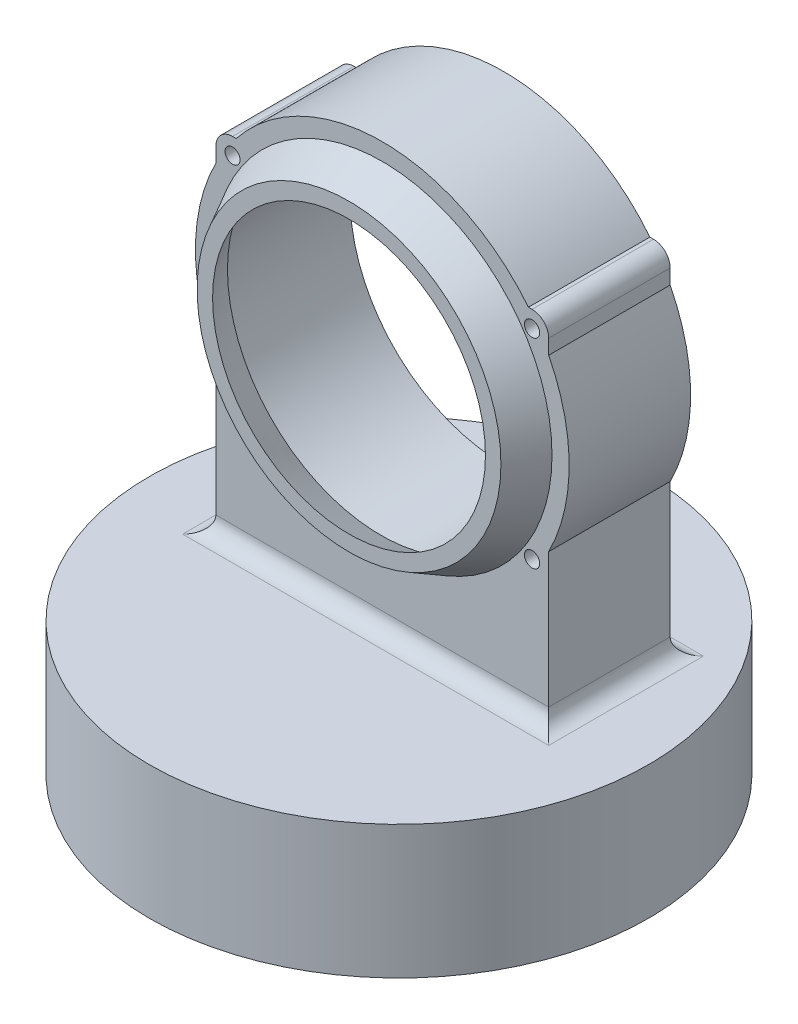
ISO-10303-21;
HEADER;
FILE_DESCRIPTION(('STEP AP214'),'2;1');
FILE_NAME('part.step','',(''),(''),'','','');
FILE_SCHEMA(('AUTOMOTIVE_DESIGN { 1 0 10303 214 1 1 1 1 }'));
ENDSEC;
DATA;
#1=APPLICATION_CONTEXT('core data for automotive mechanical design processes');
#2=APPLICATION_PROTOCOL_DEFINITION('international standard','automotive_design',2000,#1);
#3=PRODUCT_CONTEXT('',#1,'mechanical');
#4=PRODUCT('Part','Part','',(#3));
#5=PRODUCT_RELATED_PRODUCT_CATEGORY('part','',(#4));
#6=PRODUCT_DEFINITION_FORMATION('','',#4);
#7=PRODUCT_DEFINITION_CONTEXT('part definition',#1,'design');
#8=PRODUCT_DEFINITION('design','',#6,#7);
#9=PRODUCT_DEFINITION_SHAPE('','',#8);
#10=(LENGTH_UNIT() NAMED_UNIT(*) SI_UNIT(.MILLI.,.METRE.));
#11=(NAMED_UNIT(*) PLANE_ANGLE_UNIT() SI_UNIT($,.RADIAN.));
#12=(NAMED_UNIT(*) SI_UNIT($,.STERADIAN.) SOLID_ANGLE_UNIT());
#13=UNCERTAINTY_MEASURE_WITH_UNIT(LENGTH_MEASURE(1.E-05),#10,'distance_accuracy_value','');
#14=(GEOMETRIC_REPRESENTATION_CONTEXT(3) GLOBAL_UNCERTAINTY_ASSIGNED_CONTEXT((#13)) GLOBAL_UNIT_ASSIGNED_CONTEXT((#10,
#11,#12)) REPRESENTATION_CONTEXT('',''));
#15=CARTESIAN_POINT('',(0.,0.,0.));
#16=DIRECTION('',(0.,0.,1.));
#17=DIRECTION('',(1.,0.,0.));
#18=AXIS2_PLACEMENT_3D('',#15,#16,#17);
#19=CARTESIAN_POINT('',(0.,40.,0.));
#20=DIRECTION('',(0.,-1.,0.));
#21=DIRECTION('',(0.,0.,-1.));
#22=AXIS2_PLACEMENT_3D('',#19,#20,#21);
#23=CYLINDRICAL_SURFACE('',#22,75.);
#24=CARTESIAN_POINT('',(0.,40.,0.));
#25=DIRECTION('',(0.,1.,0.));
#26=DIRECTION('',(0.,0.,1.));
#27=AXIS2_PLACEMENT_3D('',#24,#25,#26);
#28=CIRCLE('',#27,75.);
#29=CARTESIAN_POINT('',(0.,40.,75.));
#30=VERTEX_POINT('',#29);
#31=EDGE_CURVE('E338',#30,#30,#28,.T.);
#32=ORIENTED_EDGE('',*,*,#31,.F.);
#33=EDGE_LOOP('',(#32));
#34=FACE_BOUND('',#33,.T.);
#35=CARTESIAN_POINT('',(0.,0.,0.));
#36=DIRECTION('',(0.,1.,0.));
#37=DIRECTION('',(0.,0.,1.));
#38=AXIS2_PLACEMENT_3D('',#35,#36,#37);
#39=CIRCLE('',#38,75.);
#40=CARTESIAN_POINT('',(0.,0.,75.));
#41=VERTEX_POINT('',#40);
#42=EDGE_CURVE('E281',#41,#41,#39,.T.);
#43=ORIENTED_EDGE('',*,*,#42,.T.);
#44=EDGE_LOOP('',(#43));
#45=FACE_BOUND('',#44,.T.);
#46=ADVANCED_FACE('F139',(#34,#45),#23,.T.);
#47=CARTESIAN_POINT('',(0.,40.,0.));
#48=DIRECTION('',(0.,1.,0.));
#49=DIRECTION('',(0.,0.,1.));
#50=AXIS2_PLACEMENT_3D('',#47,#48,#49);
#51=PLANE('',#50);
#52=DIRECTION('',(0.,0.,1.));
#53=VECTOR('',#52,1.);
#54=CARTESIAN_POINT('',(-55.,40.,-31.5));
#55=LINE('',#54,#53);
#56=CARTESIAN_POINT('',(-55.,40.,10.));
#57=VERTEX_POINT('',#56);
#58=CARTESIAN_POINT('',(-55.,40.,-36.5));
#59=VERTEX_POINT('',#58);
#60=EDGE_CURVE('E353',#57,#59,#55,.F.);
#61=ORIENTED_EDGE('',*,*,#60,.T.);
#62=DIRECTION('',(1.,0.,0.));
#63=VECTOR('',#62,1.);
#64=CARTESIAN_POINT('',(0.,40.,-36.5));
#65=LINE('',#64,#63);
#66=CARTESIAN_POINT('',(55.,40.,-36.5));
#67=VERTEX_POINT('',#66);
#68=EDGE_CURVE('E355',#59,#67,#65,.T.);
#69=ORIENTED_EDGE('',*,*,#68,.T.);
#70=DIRECTION('',(0.,0.,1.));
#71=VECTOR('',#70,1.);
#72=CARTESIAN_POINT('',(55.,40.,0.));
#73=LINE('',#72,#71);
#74=CARTESIAN_POINT('',(55.,40.,10.));
#75=VERTEX_POINT('',#74);
#76=EDGE_CURVE('E349',#67,#75,#73,.T.);
#77=ORIENTED_EDGE('',*,*,#76,.T.);
#78=DIRECTION('',(1.,0.,0.));
#79=VECTOR('',#78,1.);
#80=CARTESIAN_POINT('',(-50.,40.,10.));
#81=LINE('',#80,#79);
#82=EDGE_CURVE('E351',#75,#57,#81,.F.);
#83=ORIENTED_EDGE('',*,*,#82,.T.);
#84=EDGE_LOOP('',(#61,#69,#77,#83));
#85=FACE_BOUND('',#84,.T.);
#86=ORIENTED_EDGE('',*,*,#31,.T.);
#87=EDGE_LOOP('',(#86));
#88=FACE_BOUND('',#87,.T.);
#89=ADVANCED_FACE('F446',(#85,#88),#51,.T.);
#90=CARTESIAN_POINT('',(0.,0.,0.));
#91=DIRECTION('',(0.,1.,0.));
#92=DIRECTION('',(0.,0.,1.));
#93=AXIS2_PLACEMENT_3D('',#90,#91,#92);
#94=PLANE('',#93);
#95=CARTESIAN_POINT('',(0.,0.,0.));
#96=DIRECTION('',(0.,-1.,0.));
#97=DIRECTION('',(0.,0.,-1.));
#98=AXIS2_PLACEMENT_3D('',#95,#96,#97);
#99=CIRCLE('',#98,61.2270642551539);
#100=CARTESIAN_POINT('',(0.,0.,-61.2270642551539));
#101=VERTEX_POINT('',#100);
#102=EDGE_CURVE('E397',#101,#101,#99,.T.);
#103=ORIENTED_EDGE('',*,*,#102,.F.);
#104=EDGE_LOOP('',(#103));
#105=FACE_BOUND('',#104,.T.);
#106=ORIENTED_EDGE('',*,*,#42,.F.);
#107=EDGE_LOOP('',(#106));
#108=FACE_BOUND('',#107,.T.);
#109=ADVANCED_FACE('F494',(#105,#108),#94,.F.);
#110=CARTESIAN_POINT('',(-50.,0.,-31.5));
#111=DIRECTION('',(-1.,0.,0.));
#112=DIRECTION('',(0.,-1.,0.));
#113=AXIS2_PLACEMENT_3D('',#110,#111,#112);
#114=PLANE('',#113);
#115=DIRECTION('',(0.,-1.,0.));
#116=VECTOR('',#115,1.);
#117=CARTESIAN_POINT('',(-50.,0.,-31.5));
#118=LINE('',#117,#116);
#119=CARTESIAN_POINT('',(-50.,85.45,-31.5));
#120=VERTEX_POINT('',#119);
#121=CARTESIAN_POINT('',(-50.,45.,-31.5));
#122=VERTEX_POINT('',#121);
#123=EDGE_CURVE('E252',#120,#122,#118,.T.);
#124=ORIENTED_EDGE('',*,*,#123,.T.);
#125=DIRECTION('',(0.,0.,1.));
#126=VECTOR('',#125,1.);
#127=CARTESIAN_POINT('',(-50.,45.,5.));
#128=LINE('',#127,#126);
#129=CARTESIAN_POINT('',(-50.,45.,5.));
#130=VERTEX_POINT('',#129);
#131=EDGE_CURVE('E163',#122,#130,#128,.T.);
#132=ORIENTED_EDGE('',*,*,#131,.T.);
#133=DIRECTION('',(0.,-1.,0.));
#134=VECTOR('',#133,1.);
#135=CARTESIAN_POINT('',(-50.,0.,5.));
#136=LINE('',#135,#134);
#137=CARTESIAN_POINT('',(-50.,85.45,5.));
#138=VERTEX_POINT('',#137);
#139=EDGE_CURVE('E270',#138,#130,#136,.T.);
#140=ORIENTED_EDGE('',*,*,#139,.F.);
#141=DIRECTION('',(0.,0.,1.));
#142=VECTOR('',#141,1.);
#143=CARTESIAN_POINT('',(-50.,85.45,-31.5));
#144=LINE('',#143,#142);
#145=EDGE_CURVE('E251',#120,#138,#144,.T.);
#146=ORIENTED_EDGE('',*,*,#145,.F.);
#147=EDGE_LOOP('',(#124,#132,#140,#146));
#148=FACE_BOUND('',#147,.T.);
#149=ADVANCED_FACE('F456',(#148),#114,.T.);
#150=CARTESIAN_POINT('',(50.,0.,-31.5));
#151=DIRECTION('',(-1.,0.,0.));
#152=DIRECTION('',(0.,-1.,0.));
#153=AXIS2_PLACEMENT_3D('',#150,#151,#152);
#154=PLANE('',#153);
#155=DIRECTION('',(0.,-1.,0.));
#156=VECTOR('',#155,1.);
#157=CARTESIAN_POINT('',(50.,0.,5.));
#158=LINE('',#157,#156);
#159=CARTESIAN_POINT('',(50.,85.45,5.));
#160=VERTEX_POINT('',#159);
#161=CARTESIAN_POINT('',(50.,45.,5.));
#162=VERTEX_POINT('',#161);
#163=EDGE_CURVE('E273',#160,#162,#158,.T.);
#164=ORIENTED_EDGE('',*,*,#163,.T.);
#165=DIRECTION('',(0.,0.,1.));
#166=VECTOR('',#165,1.);
#167=CARTESIAN_POINT('',(50.,45.,-31.5));
#168=LINE('',#167,#166);
#169=CARTESIAN_POINT('',(50.,45.,-31.5));
#170=VERTEX_POINT('',#169);
#171=EDGE_CURVE('E12',#162,#170,#168,.F.);
#172=ORIENTED_EDGE('',*,*,#171,.T.);
#173=DIRECTION('',(0.,-1.,0.));
#174=VECTOR('',#173,1.);
#175=CARTESIAN_POINT('',(50.,0.,-31.5));
#176=LINE('',#175,#174);
#177=CARTESIAN_POINT('',(50.,85.45,-31.5));
#178=VERTEX_POINT('',#177);
#179=EDGE_CURVE('E260',#178,#170,#176,.T.);
#180=ORIENTED_EDGE('',*,*,#179,.F.);
#181=DIRECTION('',(0.,0.,1.));
#182=VECTOR('',#181,1.);
#183=CARTESIAN_POINT('',(50.,85.45,-31.5));
#184=LINE('',#183,#182);
#185=EDGE_CURVE('E242',#178,#160,#184,.T.);
#186=ORIENTED_EDGE('',*,*,#185,.T.);
#187=EDGE_LOOP('',(#164,#172,#180,#186));
#188=FACE_BOUND('',#187,.T.);
#189=ADVANCED_FACE('F268',(#188),#154,.F.);
#190=CARTESIAN_POINT('',(0.,0.,-31.5));
#191=DIRECTION('',(0.,0.,1.));
#192=DIRECTION('',(1.,0.,0.));
#193=AXIS2_PLACEMENT_3D('',#190,#191,#192);
#194=PLANE('',#193);
#195=CARTESIAN_POINT('',(-44.9999999999515,80.9732583431032,-31.5));
#196=DIRECTION('',(0.,0.,-1.));
#197=DIRECTION('',(1.,0.,0.));
#198=AXIS2_PLACEMENT_3D('',#195,#196,#197);
#199=CIRCLE('',#198,2.24827199869903);
#200=CARTESIAN_POINT('',(-42.7517280012524,80.9732583431032,-31.5));
#201=VERTEX_POINT('',#200);
#202=EDGE_CURVE('E406',#201,#201,#199,.T.);
#203=ORIENTED_EDGE('',*,*,#202,.F.);
#204=EDGE_LOOP('',(#203));
#205=FACE_BOUND('',#204,.T.);
#206=CARTESIAN_POINT('',(45.0000004749185,80.9732595287534,-31.5));
#207=DIRECTION('',(0.,0.,-1.));
#208=DIRECTION('',(1.,0.,0.));
#209=AXIS2_PLACEMENT_3D('',#206,#207,#208);
#210=CIRCLE('',#209,2.28310755001485);
#211=CARTESIAN_POINT('',(47.2831080249333,80.9732595287534,-31.5));
#212=VERTEX_POINT('',#211);
#213=EDGE_CURVE('E413',#212,#212,#210,.T.);
#214=ORIENTED_EDGE('',*,*,#213,.F.);
#215=EDGE_LOOP('',(#214));
#216=FACE_BOUND('',#215,.T.);
#217=CARTESIAN_POINT('',(45.0000004749185,141.000390200784,-31.5));
#218=DIRECTION('',(0.,0.,-1.));
#219=DIRECTION('',(-1.,0.,0.));
#220=AXIS2_PLACEMENT_3D('',#217,#218,#219);
#221=CIRCLE('',#220,2.28310755001485);
#222=CARTESIAN_POINT('',(42.7168929249036,141.000390200784,-31.5));
#223=VERTEX_POINT('',#222);
#224=EDGE_CURVE('E410',#223,#223,#221,.T.);
#225=ORIENTED_EDGE('',*,*,#224,.F.);
#226=EDGE_LOOP('',(#225));
#227=FACE_BOUND('',#226,.T.);
#228=CARTESIAN_POINT('',(-44.9999999999515,141.000391386434,-31.5));
#229=DIRECTION('',(0.,0.,-1.));
#230=DIRECTION('',(-1.,0.,0.));
#231=AXIS2_PLACEMENT_3D('',#228,#229,#230);
#232=CIRCLE('',#231,2.24827199869904);
#233=CARTESIAN_POINT('',(-47.2482719986505,141.000391386434,-31.5));
#234=VERTEX_POINT('',#233);
#235=EDGE_CURVE('E378',#234,#234,#232,.T.);
#236=ORIENTED_EDGE('',*,*,#235,.F.);
#237=EDGE_LOOP('',(#236));
#238=FACE_BOUND('',#237,.T.);
#239=ORIENTED_EDGE('',*,*,#179,.T.);
#240=DIRECTION('',(1.,0.,0.));
#241=VECTOR('',#240,1.);
#242=CARTESIAN_POINT('',(0.,45.,-31.5));
#243=LINE('',#242,#241);
#244=EDGE_CURVE('E358',#170,#122,#243,.F.);
#245=ORIENTED_EDGE('',*,*,#244,.T.);
#246=ORIENTED_EDGE('',*,*,#123,.F.);
#247=CARTESIAN_POINT('',(0.,111.000391386435,-31.5));
#248=DIRECTION('',(0.,0.,1.));
#249=DIRECTION('',(1.,0.,0.));
#250=AXIS2_PLACEMENT_3D('',#247,#248,#249);
#251=CIRCLE('',#250,56.15);
#252=CARTESIAN_POINT('',(-50.,136.550782772869,-31.5));
#253=VERTEX_POINT('',#252);
#254=EDGE_CURVE('E264',#253,#120,#251,.T.);
#255=ORIENTED_EDGE('',*,*,#254,.F.);
#256=DIRECTION('',(0.,-1.,0.));
#257=VECTOR('',#256,1.);
#258=CARTESIAN_POINT('',(-50.0000000000002,0.,-31.5));
#259=LINE('',#258,#257);
#260=CARTESIAN_POINT('',(-50.,141.000391386436,-31.5));
#261=VERTEX_POINT('',#260);
#262=EDGE_CURVE('E290',#261,#253,#259,.T.);
#263=ORIENTED_EDGE('',*,*,#262,.F.);
#264=CARTESIAN_POINT('',(-45.,141.000391386436,-31.5));
#265=DIRECTION('',(0.,0.,1.));
#266=DIRECTION('',(1.,0.,0.));
#267=AXIS2_PLACEMENT_3D('',#264,#265,#266);
#268=CIRCLE('',#267,5.);
#269=CARTESIAN_POINT('',(-45.,146.000391386436,-31.5));
#270=VERTEX_POINT('',#269);
#271=EDGE_CURVE('E286',#270,#261,#268,.T.);
#272=ORIENTED_EDGE('',*,*,#271,.F.);
#273=DIRECTION('',(1.,0.,0.));
#274=VECTOR('',#273,1.);
#275=CARTESIAN_POINT('',(0.,146.000391386436,-31.5));
#276=LINE('',#275,#274);
#277=CARTESIAN_POINT('',(-43.9069755278124,146.000391386436,-31.5));
#278=VERTEX_POINT('',#277);
#279=EDGE_CURVE('E283',#270,#278,#276,.T.);
#280=ORIENTED_EDGE('',*,*,#279,.T.);
#281=CARTESIAN_POINT('',(43.9069755278124,146.000391386436,-31.5));
#282=VERTEX_POINT('',#281);
#283=EDGE_CURVE('E267',#282,#278,#251,.T.);
#284=ORIENTED_EDGE('',*,*,#283,.F.);
#285=DIRECTION('',(1.,0.,0.));
#286=VECTOR('',#285,1.);
#287=CARTESIAN_POINT('',(-3.70744206204952E-12,146.000391386435,-31.5));
#288=LINE('',#287,#286);
#289=CARTESIAN_POINT('',(45.,146.000391386436,-31.5));
#290=VERTEX_POINT('',#289);
#291=EDGE_CURVE('E311',#282,#290,#288,.T.);
#292=ORIENTED_EDGE('',*,*,#291,.T.);
#293=CARTESIAN_POINT('',(45.,141.000391386436,-31.5));
#294=DIRECTION('',(0.,0.,1.));
#295=DIRECTION('',(1.,0.,0.));
#296=AXIS2_PLACEMENT_3D('',#293,#294,#295);
#297=CIRCLE('',#296,5.00000000000002);
#298=CARTESIAN_POINT('',(50.,141.000391386436,-31.5));
#299=VERTEX_POINT('',#298);
#300=EDGE_CURVE('E309',#290,#299,#297,.F.);
#301=ORIENTED_EDGE('',*,*,#300,.T.);
#302=DIRECTION('',(0.,-1.,0.));
#303=VECTOR('',#302,1.);
#304=CARTESIAN_POINT('',(49.9999999999998,0.,-31.5));
#305=LINE('',#304,#303);
#306=CARTESIAN_POINT('',(50.,136.55078277287,-31.5));
#307=VERTEX_POINT('',#306);
#308=EDGE_CURVE('E263',#299,#307,#305,.T.);
#309=ORIENTED_EDGE('',*,*,#308,.T.);
#310=EDGE_CURVE('E246',#178,#307,#251,.T.);
#311=ORIENTED_EDGE('',*,*,#310,.F.);
#312=EDGE_LOOP('',(#239,#245,#246,#255,#263,#272,#280,#284,#292,#301,#309,#311));
#313=FACE_BOUND('',#312,.T.);
#314=CARTESIAN_POINT('',(0.,111.000391386435,-31.5));
#315=DIRECTION('',(0.,0.,1.));
#316=DIRECTION('',(1.,0.,0.));
#317=AXIS2_PLACEMENT_3D('',#314,#315,#316);
#318=CIRCLE('',#317,46.15);
#319=CARTESIAN_POINT('',(46.15,111.000391386435,-31.5));
#320=VERTEX_POINT('',#319);
#321=EDGE_CURVE('E331',#320,#320,#318,.T.);
#322=ORIENTED_EDGE('',*,*,#321,.T.);
#323=EDGE_LOOP('',(#322));
#324=FACE_BOUND('',#323,.T.);
#325=ADVANCED_FACE('F257',(#205,#216,#227,#238,#313,#324),#194,.F.);
#326=CARTESIAN_POINT('',(0.,0.,5.));
#327=DIRECTION('',(0.,0.,1.));
#328=DIRECTION('',(1.,0.,0.));
#329=AXIS2_PLACEMENT_3D('',#326,#327,#328);
#330=PLANE('',#329);
#331=CARTESIAN_POINT('',(-44.9999999999515,80.9732583431032,5.));
#332=DIRECTION('',(0.,0.,1.));
#333=DIRECTION('',(1.,0.,0.));
#334=AXIS2_PLACEMENT_3D('',#331,#332,#333);
#335=CIRCLE('',#334,2.24827199869903);
#336=CARTESIAN_POINT('',(-42.7517280012524,80.9732583431032,5.));
#337=VERTEX_POINT('',#336);
#338=EDGE_CURVE('E365',#337,#337,#335,.T.);
#339=ORIENTED_EDGE('',*,*,#338,.F.);
#340=EDGE_LOOP('',(#339));
#341=FACE_BOUND('',#340,.T.);
#342=CARTESIAN_POINT('',(45.0000004749185,80.9732595287534,5.));
#343=DIRECTION('',(0.,0.,1.));
#344=DIRECTION('',(1.,0.,0.));
#345=AXIS2_PLACEMENT_3D('',#342,#343,#344);
#346=CIRCLE('',#345,2.28310755001485);
#347=CARTESIAN_POINT('',(47.2831080249333,80.9732595287534,5.));
#348=VERTEX_POINT('',#347);
#349=EDGE_CURVE('E381',#348,#348,#346,.T.);
#350=ORIENTED_EDGE('',*,*,#349,.F.);
#351=EDGE_LOOP('',(#350));
#352=FACE_BOUND('',#351,.T.);
#353=CARTESIAN_POINT('',(45.0000004749185,141.000390200784,5.));
#354=DIRECTION('',(0.,0.,1.));
#355=DIRECTION('',(1.,0.,0.));
#356=AXIS2_PLACEMENT_3D('',#353,#354,#355);
#357=CIRCLE('',#356,2.28310755001485);
#358=CARTESIAN_POINT('',(47.2831080249333,141.000390200784,5.));
#359=VERTEX_POINT('',#358);
#360=EDGE_CURVE('E377',#359,#359,#357,.T.);
#361=ORIENTED_EDGE('',*,*,#360,.F.);
#362=EDGE_LOOP('',(#361));
#363=FACE_BOUND('',#362,.T.);
#364=CARTESIAN_POINT('',(-44.9999999999515,141.000391386434,5.));
#365=DIRECTION('',(0.,0.,1.));
#366=DIRECTION('',(1.,0.,0.));
#367=AXIS2_PLACEMENT_3D('',#364,#365,#366);
#368=CIRCLE('',#367,2.24827199869904);
#369=CARTESIAN_POINT('',(-42.7517280012524,141.000391386434,5.));
#370=VERTEX_POINT('',#369);
#371=EDGE_CURVE('E374',#370,#370,#368,.T.);
#372=ORIENTED_EDGE('',*,*,#371,.F.);
#373=EDGE_LOOP('',(#372));
#374=FACE_BOUND('',#373,.T.);
#375=CARTESIAN_POINT('',(0.,111.000391386435,5.));
#376=DIRECTION('',(0.,0.,1.));
#377=DIRECTION('',(1.,0.,0.));
#378=AXIS2_PLACEMENT_3D('',#375,#376,#377);
#379=CIRCLE('',#378,51.);
#380=CARTESIAN_POINT('',(51.,111.000391386435,5.));
#381=VERTEX_POINT('',#380);
#382=EDGE_CURVE('E276',#381,#381,#379,.T.);
#383=ORIENTED_EDGE('',*,*,#382,.F.);
#384=EDGE_LOOP('',(#383));
#385=FACE_BOUND('',#384,.T.);
#386=ORIENTED_EDGE('',*,*,#139,.T.);
#387=DIRECTION('',(1.,0.,0.));
#388=VECTOR('',#387,1.);
#389=CARTESIAN_POINT('',(50.,45.,5.));
#390=LINE('',#389,#388);
#391=EDGE_CURVE('E148',#130,#162,#390,.T.);
#392=ORIENTED_EDGE('',*,*,#391,.T.);
#393=ORIENTED_EDGE('',*,*,#163,.F.);
#394=CARTESIAN_POINT('',(0.,111.000391386435,5.));
#395=DIRECTION('',(0.,0.,1.));
#396=DIRECTION('',(1.,0.,0.));
#397=AXIS2_PLACEMENT_3D('',#394,#395,#396);
#398=CIRCLE('',#397,56.15);
#399=CARTESIAN_POINT('',(50.,136.55078277287,5.));
#400=VERTEX_POINT('',#399);
#401=EDGE_CURVE('E248',#160,#400,#398,.T.);
#402=ORIENTED_EDGE('',*,*,#401,.T.);
#403=DIRECTION('',(0.,-1.,0.));
#404=VECTOR('',#403,1.);
#405=CARTESIAN_POINT('',(49.9999999999998,0.,5.));
#406=LINE('',#405,#404);
#407=CARTESIAN_POINT('',(50.,141.000391386436,5.));
#408=VERTEX_POINT('',#407);
#409=EDGE_CURVE('E312',#408,#400,#406,.T.);
#410=ORIENTED_EDGE('',*,*,#409,.F.);
#411=CARTESIAN_POINT('',(45.,141.000391386436,5.));
#412=DIRECTION('',(0.,0.,1.));
#413=DIRECTION('',(1.,0.,0.));
#414=AXIS2_PLACEMENT_3D('',#411,#412,#413);
#415=CIRCLE('',#414,5.00000000000002);
#416=CARTESIAN_POINT('',(45.,146.000391386436,5.));
#417=VERTEX_POINT('',#416);
#418=EDGE_CURVE('E316',#417,#408,#415,.F.);
#419=ORIENTED_EDGE('',*,*,#418,.F.);
#420=DIRECTION('',(1.,0.,0.));
#421=VECTOR('',#420,1.);
#422=CARTESIAN_POINT('',(-3.70744206204952E-12,146.000391386435,5.));
#423=LINE('',#422,#421);
#424=CARTESIAN_POINT('',(43.9069755278124,146.000391386436,5.));
#425=VERTEX_POINT('',#424);
#426=EDGE_CURVE('E319',#425,#417,#423,.T.);
#427=ORIENTED_EDGE('',*,*,#426,.F.);
#428=CARTESIAN_POINT('',(-43.9069755278124,146.000391386436,5.));
#429=VERTEX_POINT('',#428);
#430=EDGE_CURVE('E265',#425,#429,#398,.T.);
#431=ORIENTED_EDGE('',*,*,#430,.T.);
#432=DIRECTION('',(1.,0.,0.));
#433=VECTOR('',#432,1.);
#434=CARTESIAN_POINT('',(0.,146.000391386436,5.));
#435=LINE('',#434,#433);
#436=CARTESIAN_POINT('',(-45.,146.000391386436,5.));
#437=VERTEX_POINT('',#436);
#438=EDGE_CURVE('E294',#437,#429,#435,.T.);
#439=ORIENTED_EDGE('',*,*,#438,.F.);
#440=CARTESIAN_POINT('',(-45.,141.000391386436,5.));
#441=DIRECTION('',(0.,0.,1.));
#442=DIRECTION('',(1.,0.,0.));
#443=AXIS2_PLACEMENT_3D('',#440,#441,#442);
#444=CIRCLE('',#443,5.);
#445=CARTESIAN_POINT('',(-50.,141.000391386436,5.));
#446=VERTEX_POINT('',#445);
#447=EDGE_CURVE('E297',#437,#446,#444,.T.);
#448=ORIENTED_EDGE('',*,*,#447,.T.);
#449=DIRECTION('',(0.,-1.,0.));
#450=VECTOR('',#449,1.);
#451=CARTESIAN_POINT('',(-50.0000000000002,0.,5.));
#452=LINE('',#451,#450);
#453=CARTESIAN_POINT('',(-50.,136.550782772869,5.));
#454=VERTEX_POINT('',#453);
#455=EDGE_CURVE('E287',#446,#454,#452,.T.);
#456=ORIENTED_EDGE('',*,*,#455,.T.);
#457=EDGE_CURVE('E337',#454,#138,#398,.T.);
#458=ORIENTED_EDGE('',*,*,#457,.T.);
#459=EDGE_LOOP('',(#386,#392,#393,#402,#410,#419,#427,#431,#439,#448,#456,#458));
#460=FACE_BOUND('',#459,.T.);
#461=ADVANCED_FACE('F428',(#341,#352,#363,#374,#385,#460),#330,.T.);
#462=CARTESIAN_POINT('',(-45.,141.000391386436,-31.5));
#463=DIRECTION('',(0.,0.,1.));
#464=DIRECTION('',(1.,0.,0.));
#465=AXIS2_PLACEMENT_3D('',#462,#463,#464);
#466=CYLINDRICAL_SURFACE('',#465,5.);
#467=ORIENTED_EDGE('',*,*,#447,.F.);
#468=DIRECTION('',(0.,0.,1.));
#469=VECTOR('',#468,1.);
#470=CARTESIAN_POINT('',(-45.,146.000391386436,-31.5));
#471=LINE('',#470,#469);
#472=EDGE_CURVE('E293',#270,#437,#471,.T.);
#473=ORIENTED_EDGE('',*,*,#472,.F.);
#474=ORIENTED_EDGE('',*,*,#271,.T.);
#475=DIRECTION('',(0.,0.,1.));
#476=VECTOR('',#475,1.);
#477=CARTESIAN_POINT('',(-50.,141.000391386436,-31.5));
#478=LINE('',#477,#476);
#479=EDGE_CURVE('E306',#261,#446,#478,.T.);
#480=ORIENTED_EDGE('',*,*,#479,.T.);
#481=EDGE_LOOP('',(#467,#473,#474,#480));
#482=FACE_BOUND('',#481,.T.);
#483=ADVANCED_FACE('F430',(#482),#466,.T.);
#484=CARTESIAN_POINT('',(0.,146.000391386436,-31.5));
#485=DIRECTION('',(0.,-1.,0.));
#486=DIRECTION('',(0.,0.,-1.));
#487=AXIS2_PLACEMENT_3D('',#484,#485,#486);
#488=PLANE('',#487);
#489=ORIENTED_EDGE('',*,*,#438,.T.);
#490=DIRECTION('',(0.,0.,1.));
#491=VECTOR('',#490,1.);
#492=CARTESIAN_POINT('',(-43.9069755278124,146.000391386436,-31.5));
#493=LINE('',#492,#491);
#494=EDGE_CURVE('E279',#278,#429,#493,.T.);
#495=ORIENTED_EDGE('',*,*,#494,.F.);
#496=ORIENTED_EDGE('',*,*,#279,.F.);
#497=ORIENTED_EDGE('',*,*,#472,.T.);
#498=EDGE_LOOP('',(#489,#495,#496,#497));
#499=FACE_BOUND('',#498,.T.);
#500=ADVANCED_FACE('F471',(#499),#488,.F.);
#501=CARTESIAN_POINT('',(-3.70744206204952E-12,146.000391386435,-31.5));
#502=DIRECTION('',(0.,-1.,0.));
#503=DIRECTION('',(1.,0.,0.));
#504=AXIS2_PLACEMENT_3D('',#501,#502,#503);
#505=PLANE('',#504);
#506=ORIENTED_EDGE('',*,*,#426,.T.);
#507=DIRECTION('',(0.,0.,1.));
#508=VECTOR('',#507,1.);
#509=CARTESIAN_POINT('',(45.,146.000391386436,-31.5));
#510=LINE('',#509,#508);
#511=EDGE_CURVE('E315',#290,#417,#510,.T.);
#512=ORIENTED_EDGE('',*,*,#511,.F.);
#513=ORIENTED_EDGE('',*,*,#291,.F.);
#514=DIRECTION('',(0.,0.,1.));
#515=VECTOR('',#514,1.);
#516=CARTESIAN_POINT('',(43.9069755278124,146.000391386436,-31.5));
#517=LINE('',#516,#515);
#518=EDGE_CURVE('E327',#282,#425,#517,.T.);
#519=ORIENTED_EDGE('',*,*,#518,.T.);
#520=EDGE_LOOP('',(#506,#512,#513,#519));
#521=FACE_BOUND('',#520,.T.);
#522=ADVANCED_FACE('F478',(#521),#505,.F.);
#523=CARTESIAN_POINT('',(45.,141.000391386436,-31.5));
#524=DIRECTION('',(0.,0.,1.));
#525=DIRECTION('',(1.,0.,0.));
#526=AXIS2_PLACEMENT_3D('',#523,#524,#525);
#527=CYLINDRICAL_SURFACE('',#526,5.00000000000002);
#528=ORIENTED_EDGE('',*,*,#418,.T.);
#529=DIRECTION('',(0.,0.,1.));
#530=VECTOR('',#529,1.);
#531=CARTESIAN_POINT('',(50.,141.000391386436,-31.5));
#532=LINE('',#531,#530);
#533=EDGE_CURVE('E298',#299,#408,#532,.T.);
#534=ORIENTED_EDGE('',*,*,#533,.F.);
#535=ORIENTED_EDGE('',*,*,#300,.F.);
#536=ORIENTED_EDGE('',*,*,#511,.T.);
#537=EDGE_LOOP('',(#528,#534,#535,#536));
#538=FACE_BOUND('',#537,.T.);
#539=ADVANCED_FACE('F483',(#538),#527,.T.);
#540=CARTESIAN_POINT('',(-50.0000000000002,0.,-31.5));
#541=DIRECTION('',(-1.,0.,0.));
#542=DIRECTION('',(0.,-1.,0.));
#543=AXIS2_PLACEMENT_3D('',#540,#541,#542);
#544=PLANE('',#543);
#545=ORIENTED_EDGE('',*,*,#455,.F.);
#546=ORIENTED_EDGE('',*,*,#479,.F.);
#547=ORIENTED_EDGE('',*,*,#262,.T.);
#548=DIRECTION('',(0.,0.,1.));
#549=VECTOR('',#548,1.);
#550=CARTESIAN_POINT('',(-50.,136.550782772869,-31.5));
#551=LINE('',#550,#549);
#552=EDGE_CURVE('E304',#253,#454,#551,.T.);
#553=ORIENTED_EDGE('',*,*,#552,.T.);
#554=EDGE_LOOP('',(#545,#546,#547,#553));
#555=FACE_BOUND('',#554,.T.);
#556=ADVANCED_FACE('F464',(#555),#544,.T.);
#557=CARTESIAN_POINT('',(49.9999999999998,0.,-31.5));
#558=DIRECTION('',(-1.,0.,0.));
#559=DIRECTION('',(0.,-1.,0.));
#560=AXIS2_PLACEMENT_3D('',#557,#558,#559);
#561=PLANE('',#560);
#562=ORIENTED_EDGE('',*,*,#409,.T.);
#563=DIRECTION('',(0.,0.,1.));
#564=VECTOR('',#563,1.);
#565=CARTESIAN_POINT('',(50.,136.55078277287,-31.5));
#566=LINE('',#565,#564);
#567=EDGE_CURVE('E325',#307,#400,#566,.T.);
#568=ORIENTED_EDGE('',*,*,#567,.F.);
#569=ORIENTED_EDGE('',*,*,#308,.F.);
#570=ORIENTED_EDGE('',*,*,#533,.T.);
#571=EDGE_LOOP('',(#562,#568,#569,#570));
#572=FACE_BOUND('',#571,.T.);
#573=ADVANCED_FACE('F486',(#572),#561,.F.);
#574=CARTESIAN_POINT('',(0.,111.000391386435,-31.5));
#575=DIRECTION('',(0.,0.,1.));
#576=DIRECTION('',(1.,0.,0.));
#577=AXIS2_PLACEMENT_3D('',#574,#575,#576);
#578=CYLINDRICAL_SURFACE('',#577,56.15);
#579=ORIENTED_EDGE('',*,*,#185,.F.);
#580=ORIENTED_EDGE('',*,*,#310,.T.);
#581=ORIENTED_EDGE('',*,*,#567,.T.);
#582=ORIENTED_EDGE('',*,*,#401,.F.);
#583=EDGE_LOOP('',(#579,#580,#581,#582));
#584=FACE_BOUND('',#583,.T.);
#585=ADVANCED_FACE('F244',(#584),#578,.T.);
#586=ORIENTED_EDGE('',*,*,#254,.T.);
#587=ORIENTED_EDGE('',*,*,#145,.T.);
#588=ORIENTED_EDGE('',*,*,#457,.F.);
#589=ORIENTED_EDGE('',*,*,#552,.F.);
#590=EDGE_LOOP('',(#586,#587,#588,#589));
#591=FACE_BOUND('',#590,.T.);
#592=ADVANCED_FACE('F459',(#591),#578,.T.);
#593=ORIENTED_EDGE('',*,*,#283,.T.);
#594=ORIENTED_EDGE('',*,*,#494,.T.);
#595=ORIENTED_EDGE('',*,*,#430,.F.);
#596=ORIENTED_EDGE('',*,*,#518,.F.);
#597=EDGE_LOOP('',(#593,#594,#595,#596));
#598=FACE_BOUND('',#597,.T.);
#599=ADVANCED_FACE('F475',(#598),#578,.T.);
#600=CARTESIAN_POINT('',(0.,111.000391386435,-31.5));
#601=DIRECTION('',(0.,0.,1.));
#602=DIRECTION('',(1.,0.,0.));
#603=AXIS2_PLACEMENT_3D('',#600,#601,#602);
#604=CYLINDRICAL_SURFACE('',#603,46.15);
#605=CARTESIAN_POINT('',(0.,111.000391386435,5.37513176706015));
#606=DIRECTION('',(0.,0.,-1.));
#607=DIRECTION('',(-1.,0.,0.));
#608=AXIS2_PLACEMENT_3D('',#605,#606,#607);
#609=CIRCLE('',#608,46.15);
#610=CARTESIAN_POINT('',(-46.15,111.000391386435,5.37513176706015));
#611=VERTEX_POINT('',#610);
#612=EDGE_CURVE('E341',#611,#611,#609,.F.);
#613=ORIENTED_EDGE('',*,*,#612,.T.);
#614=EDGE_LOOP('',(#613));
#615=FACE_BOUND('',#614,.T.);
#616=ORIENTED_EDGE('',*,*,#321,.F.);
#617=EDGE_LOOP('',(#616));
#618=FACE_BOUND('',#617,.T.);
#619=ADVANCED_FACE('F501',(#615,#618),#604,.F.);
#620=CARTESIAN_POINT('',(0.,111.000391386435,15.));
#621=DIRECTION('',(0.,0.,1.));
#622=DIRECTION('',(1.,0.,0.));
#623=AXIS2_PLACEMENT_3D('',#620,#621,#622);
#624=PLANE('',#623);
#625=CARTESIAN_POINT('',(0.,111.000391386435,15.));
#626=DIRECTION('',(0.,0.,1.));
#627=DIRECTION('',(1.,0.,0.));
#628=AXIS2_PLACEMENT_3D('',#625,#626,#627);
#629=CIRCLE('',#628,45.6492773975079);
#630=CARTESIAN_POINT('',(45.6492773975079,111.000391386435,15.));
#631=VERTEX_POINT('',#630);
#632=EDGE_CURVE('E346',#631,#631,#629,.T.);
#633=ORIENTED_EDGE('',*,*,#632,.T.);
#634=EDGE_LOOP('',(#633));
#635=FACE_BOUND('',#634,.T.);
#636=CARTESIAN_POINT('',(0.,111.000391386435,15.));
#637=DIRECTION('',(0.,0.,1.));
#638=DIRECTION('',(1.,0.,0.));
#639=AXIS2_PLACEMENT_3D('',#636,#637,#638);
#640=CIRCLE('',#639,41.);
#641=CARTESIAN_POINT('',(41.,111.000391386435,15.));
#642=VERTEX_POINT('',#641);
#643=EDGE_CURVE('E373',#642,#642,#640,.T.);
#644=ORIENTED_EDGE('',*,*,#643,.F.);
#645=EDGE_LOOP('',(#644));
#646=FACE_BOUND('',#645,.T.);
#647=ADVANCED_FACE('F433',(#635,#646),#624,.T.);
#648=CARTESIAN_POINT('',(0.,111.000391386435,5.));
#649=DIRECTION('',(0.,0.,-1.));
#650=DIRECTION('',(-1.,0.,0.));
#651=AXIS2_PLACEMENT_3D('',#648,#649,#650);
#652=CONICAL_SURFACE('',#651,46.3507226024922,0.49131018443641);
#653=ORIENTED_EDGE('',*,*,#643,.T.);
#654=EDGE_LOOP('',(#653));
#655=FACE_BOUND('',#654,.T.);
#656=ORIENTED_EDGE('',*,*,#612,.F.);
#657=EDGE_LOOP('',(#656));
#658=FACE_BOUND('',#657,.T.);
#659=ADVANCED_FACE('F515',(#655,#658),#652,.F.);
#660=CARTESIAN_POINT('',(0.,111.000391386435,15.));
#661=DIRECTION('',(0.,0.,-1.));
#662=DIRECTION('',(-1.,0.,0.));
#663=AXIS2_PLACEMENT_3D('',#660,#661,#662);
#664=CONICAL_SURFACE('',#663,45.6492773975079,0.491310184436401);
#665=ORIENTED_EDGE('',*,*,#382,.T.);
#666=EDGE_LOOP('',(#665));
#667=FACE_BOUND('',#666,.T.);
#668=ORIENTED_EDGE('',*,*,#632,.F.);
#669=EDGE_LOOP('',(#668));
#670=FACE_BOUND('',#669,.T.);
#671=ADVANCED_FACE('F425',(#667,#670),#664,.T.);
#672=CARTESIAN_POINT('',(0.,45.,10.));
#673=DIRECTION('',(-1.,0.,0.));
#674=DIRECTION('',(0.,0.,1.));
#675=AXIS2_PLACEMENT_3D('',#672,#673,#674);
#676=CYLINDRICAL_SURFACE('',#675,5.);
#677=CARTESIAN_POINT('',(55.,45.,10.));
#678=DIRECTION('',(-0.707106781186547,0.,0.707106781186547));
#679=DIRECTION('',(0.707106781186547,0.,0.707106781186547));
#680=AXIS2_PLACEMENT_3D('',#677,#678,#679);
#681=ELLIPSE('',#680,7.07106781186547,5.);
#682=EDGE_CURVE('E367',#162,#75,#681,.T.);
#683=ORIENTED_EDGE('',*,*,#682,.F.);
#684=ORIENTED_EDGE('',*,*,#391,.F.);
#685=CARTESIAN_POINT('',(-55.,45.,10.));
#686=DIRECTION('',(-0.707106781186547,0.,-0.707106781186547));
#687=DIRECTION('',(-0.707106781186547,0.,0.707106781186547));
#688=AXIS2_PLACEMENT_3D('',#685,#686,#687);
#689=ELLIPSE('',#688,7.07106781186547,5.);
#690=EDGE_CURVE('E370',#57,#130,#689,.F.);
#691=ORIENTED_EDGE('',*,*,#690,.F.);
#692=ORIENTED_EDGE('',*,*,#82,.F.);
#693=EDGE_LOOP('',(#683,#684,#691,#692));
#694=FACE_BOUND('',#693,.T.);
#695=ADVANCED_FACE('F141',(#694),#676,.F.);
#696=CARTESIAN_POINT('',(-55.,45.,-31.5));
#697=DIRECTION('',(0.,0.,-1.));
#698=DIRECTION('',(-1.,0.,0.));
#699=AXIS2_PLACEMENT_3D('',#696,#697,#698);
#700=CYLINDRICAL_SURFACE('',#699,5.);
#701=ORIENTED_EDGE('',*,*,#690,.T.);
#702=ORIENTED_EDGE('',*,*,#131,.F.);
#703=CARTESIAN_POINT('',(-55.,45.,-36.5));
#704=DIRECTION('',(0.707106781186547,0.,-0.707106781186547));
#705=DIRECTION('',(-0.707106781186547,0.,-0.707106781186547));
#706=AXIS2_PLACEMENT_3D('',#703,#704,#705);
#707=ELLIPSE('',#706,7.07106781186547,5.);
#708=EDGE_CURVE('E364',#59,#122,#707,.F.);
#709=ORIENTED_EDGE('',*,*,#708,.F.);
#710=ORIENTED_EDGE('',*,*,#60,.F.);
#711=EDGE_LOOP('',(#701,#702,#709,#710));
#712=FACE_BOUND('',#711,.T.);
#713=ADVANCED_FACE('F442',(#712),#700,.F.);
#714=CARTESIAN_POINT('',(55.,45.,0.));
#715=DIRECTION('',(0.,0.,1.));
#716=DIRECTION('',(1.,0.,0.));
#717=AXIS2_PLACEMENT_3D('',#714,#715,#716);
#718=CYLINDRICAL_SURFACE('',#717,5.);
#719=ORIENTED_EDGE('',*,*,#682,.T.);
#720=ORIENTED_EDGE('',*,*,#76,.F.);
#721=CARTESIAN_POINT('',(55.,45.,-36.5));
#722=DIRECTION('',(0.707106781186547,0.,0.707106781186547));
#723=DIRECTION('',(-0.707106781186547,0.,0.707106781186547));
#724=AXIS2_PLACEMENT_3D('',#721,#722,#723);
#725=ELLIPSE('',#724,7.07106781186547,5.);
#726=EDGE_CURVE('E362',#170,#67,#725,.T.);
#727=ORIENTED_EDGE('',*,*,#726,.F.);
#728=ORIENTED_EDGE('',*,*,#171,.F.);
#729=EDGE_LOOP('',(#719,#720,#727,#728));
#730=FACE_BOUND('',#729,.T.);
#731=ADVANCED_FACE('F450',(#730),#718,.F.);
#732=CARTESIAN_POINT('',(0.,45.,-36.5));
#733=DIRECTION('',(1.,0.,0.));
#734=DIRECTION('',(0.,0.,-1.));
#735=AXIS2_PLACEMENT_3D('',#732,#733,#734);
#736=CYLINDRICAL_SURFACE('',#735,5.);
#737=ORIENTED_EDGE('',*,*,#708,.T.);
#738=ORIENTED_EDGE('',*,*,#244,.F.);
#739=ORIENTED_EDGE('',*,*,#726,.T.);
#740=ORIENTED_EDGE('',*,*,#68,.F.);
#741=EDGE_LOOP('',(#737,#738,#739,#740));
#742=FACE_BOUND('',#741,.T.);
#743=ADVANCED_FACE('F453',(#742),#736,.F.);
#744=CARTESIAN_POINT('',(-44.9999999999515,141.000391386434,75.));
#745=DIRECTION('',(0.,0.,-1.));
#746=DIRECTION('',(-1.,0.,0.));
#747=AXIS2_PLACEMENT_3D('',#744,#745,#746);
#748=CYLINDRICAL_SURFACE('',#747,2.24827199869904);
#749=ORIENTED_EDGE('',*,*,#371,.T.);
#750=EDGE_LOOP('',(#749));
#751=FACE_BOUND('',#750,.T.);
#752=ORIENTED_EDGE('',*,*,#235,.T.);
#753=EDGE_LOOP('',(#752));
#754=FACE_BOUND('',#753,.T.);
#755=ADVANCED_FACE('F527',(#751,#754),#748,.F.);
#756=CARTESIAN_POINT('',(45.0000004749185,141.000390200784,75.));
#757=DIRECTION('',(0.,0.,-1.));
#758=DIRECTION('',(-1.,0.,0.));
#759=AXIS2_PLACEMENT_3D('',#756,#757,#758);
#760=CYLINDRICAL_SURFACE('',#759,2.28310755001485);
#761=ORIENTED_EDGE('',*,*,#360,.T.);
#762=EDGE_LOOP('',(#761));
#763=FACE_BOUND('',#762,.T.);
#764=ORIENTED_EDGE('',*,*,#224,.T.);
#765=EDGE_LOOP('',(#764));
#766=FACE_BOUND('',#765,.T.);
#767=ADVANCED_FACE('F655',(#763,#766),#760,.F.);
#768=CARTESIAN_POINT('',(45.0000004749185,80.9732595287534,75.));
#769=DIRECTION('',(0.,0.,-1.));
#770=DIRECTION('',(-1.,0.,0.));
#771=AXIS2_PLACEMENT_3D('',#768,#769,#770);
#772=CYLINDRICAL_SURFACE('',#771,2.28310755001485);
#773=ORIENTED_EDGE('',*,*,#349,.T.);
#774=EDGE_LOOP('',(#773));
#775=FACE_BOUND('',#774,.T.);
#776=ORIENTED_EDGE('',*,*,#213,.T.);
#777=EDGE_LOOP('',(#776));
#778=FACE_BOUND('',#777,.T.);
#779=ADVANCED_FACE('F665',(#775,#778),#772,.F.);
#780=CARTESIAN_POINT('',(-44.9999999999515,80.9732583431032,75.));
#781=DIRECTION('',(0.,0.,-1.));
#782=DIRECTION('',(-1.,0.,0.));
#783=AXIS2_PLACEMENT_3D('',#780,#781,#782);
#784=CYLINDRICAL_SURFACE('',#783,2.24827199869903);
#785=ORIENTED_EDGE('',*,*,#338,.T.);
#786=EDGE_LOOP('',(#785));
#787=FACE_BOUND('',#786,.T.);
#788=ORIENTED_EDGE('',*,*,#202,.T.);
#789=EDGE_LOOP('',(#788));
#790=FACE_BOUND('',#789,.T.);
#791=ADVANCED_FACE('F674',(#787,#790),#784,.F.);
#792=CARTESIAN_POINT('',(0.,1.5,0.));
#793=DIRECTION('',(0.,-1.,0.));
#794=DIRECTION('',(0.,0.,-1.));
#795=AXIS2_PLACEMENT_3D('',#792,#793,#794);
#796=CYLINDRICAL_SURFACE('',#795,61.2270642551539);
#797=CARTESIAN_POINT('',(0.,1.5,0.));
#798=DIRECTION('',(0.,-1.,0.));
#799=DIRECTION('',(0.,0.,-1.));
#800=AXIS2_PLACEMENT_3D('',#797,#798,#799);
#801=CIRCLE('',#800,61.2270642551539);
#802=CARTESIAN_POINT('',(0.,1.5,-61.2270642551539));
#803=VERTEX_POINT('',#802);
#804=EDGE_CURVE('E401',#803,#803,#801,.T.);
#805=ORIENTED_EDGE('',*,*,#804,.F.);
#806=EDGE_LOOP('',(#805));
#807=FACE_BOUND('',#806,.T.);
#808=ORIENTED_EDGE('',*,*,#102,.T.);
#809=EDGE_LOOP('',(#808));
#810=FACE_BOUND('',#809,.T.);
#811=ADVANCED_FACE('F683',(#807,#810),#796,.F.);
#812=CARTESIAN_POINT('',(0.,1.5,0.));
#813=DIRECTION('',(0.,-1.,0.));
#814=DIRECTION('',(0.,0.,-1.));
#815=AXIS2_PLACEMENT_3D('',#812,#813,#814);
#816=PLANE('',#815);
#817=CARTESIAN_POINT('',(-2.64739923814495,1.5,28.2743926064995));
#818=DIRECTION('',(0.,-1.,0.));
#819=DIRECTION('',(0.,0.,-1.));
#820=AXIS2_PLACEMENT_3D('',#817,#818,#819);
#821=CIRCLE('',#820,2.49999999994906);
#822=CARTESIAN_POINT('',(-2.64739923814495,1.5,25.7743926065505));
#823=VERTEX_POINT('',#822);
#824=EDGE_CURVE('E143',#823,#823,#821,.T.);
#825=ORIENTED_EDGE('',*,*,#824,.F.);
#826=EDGE_LOOP('',(#825));
#827=FACE_BOUND('',#826,.T.);
#828=CARTESIAN_POINT('',(24.2079536283537,1.5,-14.8467161734918));
#829=DIRECTION('',(0.,-1.,0.));
#830=DIRECTION('',(0.,0.,-1.));
#831=AXIS2_PLACEMENT_3D('',#828,#829,#830);
#832=CIRCLE('',#831,2.49999999994906);
#833=CARTESIAN_POINT('',(24.2079536283537,1.5,-17.3467161734408));
#834=VERTEX_POINT('',#833);
#835=EDGE_CURVE('E392',#834,#834,#832,.T.);
#836=ORIENTED_EDGE('',*,*,#835,.F.);
#837=EDGE_LOOP('',(#836));
#838=FACE_BOUND('',#837,.T.);
#839=CARTESIAN_POINT('',(2.64739923835811,1.5,-28.2743926067411));
#840=DIRECTION('',(0.,-1.,0.));
#841=DIRECTION('',(0.,0.,-1.));
#842=AXIS2_PLACEMENT_3D('',#839,#840,#841);
#843=CIRCLE('',#842,2.49999999994906);
#844=CARTESIAN_POINT('',(2.64739923835811,1.5,-30.7743926066902));
#845=VERTEX_POINT('',#844);
#846=EDGE_CURVE('E389',#845,#845,#843,.T.);
#847=ORIENTED_EDGE('',*,*,#846,.F.);
#848=EDGE_LOOP('',(#847));
#849=FACE_BOUND('',#848,.T.);
#850=CARTESIAN_POINT('',(-24.2079536281406,1.5,14.8467161732502));
#851=DIRECTION('',(0.,-1.,0.));
#852=DIRECTION('',(0.,0.,-1.));
#853=AXIS2_PLACEMENT_3D('',#850,#851,#852);
#854=CIRCLE('',#853,2.49999999994907);
#855=CARTESIAN_POINT('',(-24.2079536281406,1.5,12.3467161733011));
#856=VERTEX_POINT('',#855);
#857=EDGE_CURVE('E386',#856,#856,#854,.T.);
#858=ORIENTED_EDGE('',*,*,#857,.F.);
#859=EDGE_LOOP('',(#858));
#860=FACE_BOUND('',#859,.T.);
#861=ORIENTED_EDGE('',*,*,#804,.T.);
#862=EDGE_LOOP('',(#861));
#863=FACE_BOUND('',#862,.T.);
#864=ADVANCED_FACE('F698',(#827,#838,#849,#860,#863),#816,.T.);
#865=CARTESIAN_POINT('',(-24.2079536281406,10.,14.8467161732502));
#866=DIRECTION('',(0.,-1.,0.));
#867=DIRECTION('',(0.,0.,-1.));
#868=AXIS2_PLACEMENT_3D('',#865,#866,#867);
#869=CYLINDRICAL_SURFACE('',#868,2.49999999994907);
#870=ORIENTED_EDGE('',*,*,#857,.T.);
#871=EDGE_LOOP('',(#870));
#872=FACE_BOUND('',#871,.T.);
#873=CARTESIAN_POINT('',(-24.2079536281406,10.,14.8467161732502));
#874=DIRECTION('',(0.,-1.,0.));
#875=DIRECTION('',(0.,0.,-1.));
#876=AXIS2_PLACEMENT_3D('',#873,#874,#875);
#877=CIRCLE('',#876,2.49999999994907);
#878=CARTESIAN_POINT('',(-24.2079536281406,10.,12.3467161733011));
#879=VERTEX_POINT('',#878);
#880=EDGE_CURVE('E840',#879,#879,#877,.T.);
#881=ORIENTED_EDGE('',*,*,#880,.F.);
#882=EDGE_LOOP('',(#881));
#883=FACE_BOUND('',#882,.T.);
#884=ADVANCED_FACE('F707',(#872,#883),#869,.F.);
#885=CARTESIAN_POINT('',(-24.2079536281406,10.,14.8467161732502));
#886=DIRECTION('',(0.,-1.,0.));
#887=DIRECTION('',(0.,0.,-1.));
#888=AXIS2_PLACEMENT_3D('',#885,#886,#887);
#889=PLANE('',#888);
#890=ORIENTED_EDGE('',*,*,#880,.T.);
#891=EDGE_LOOP('',(#890));
#892=FACE_BOUND('',#891,.T.);
#893=ADVANCED_FACE('F716',(#892),#889,.T.);
#894=CARTESIAN_POINT('',(2.64739923835811,10.,-28.2743926067411));
#895=DIRECTION('',(0.,-1.,0.));
#896=DIRECTION('',(0.,0.,-1.));
#897=AXIS2_PLACEMENT_3D('',#894,#895,#896);
#898=CYLINDRICAL_SURFACE('',#897,2.49999999994906);
#899=ORIENTED_EDGE('',*,*,#846,.T.);
#900=EDGE_LOOP('',(#899));
#901=FACE_BOUND('',#900,.T.);
#902=CARTESIAN_POINT('',(2.64739923835811,10.,-28.2743926067411));
#903=DIRECTION('',(0.,-1.,0.));
#904=DIRECTION('',(0.,0.,-1.));
#905=AXIS2_PLACEMENT_3D('',#902,#903,#904);
#906=CIRCLE('',#905,2.49999999994906);
#907=CARTESIAN_POINT('',(2.64739923835811,10.,-30.7743926066902));
#908=VERTEX_POINT('',#907);
#909=EDGE_CURVE('E836',#908,#908,#906,.T.);
#910=ORIENTED_EDGE('',*,*,#909,.F.);
#911=EDGE_LOOP('',(#910));
#912=FACE_BOUND('',#911,.T.);
#913=ADVANCED_FACE('F725',(#901,#912),#898,.F.);
#914=CARTESIAN_POINT('',(2.64739923835811,10.,-28.2743926067411));
#915=DIRECTION('',(0.,-1.,0.));
#916=DIRECTION('',(0.,0.,-1.));
#917=AXIS2_PLACEMENT_3D('',#914,#915,#916);
#918=PLANE('',#917);
#919=ORIENTED_EDGE('',*,*,#909,.T.);
#920=EDGE_LOOP('',(#919));
#921=FACE_BOUND('',#920,.T.);
#922=ADVANCED_FACE('F734',(#921),#918,.T.);
#923=CARTESIAN_POINT('',(24.2079536283537,10.,-14.8467161734918));
#924=DIRECTION('',(0.,-1.,0.));
#925=DIRECTION('',(0.,0.,-1.));
#926=AXIS2_PLACEMENT_3D('',#923,#924,#925);
#927=CYLINDRICAL_SURFACE('',#926,2.49999999994906);
#928=ORIENTED_EDGE('',*,*,#835,.T.);
#929=EDGE_LOOP('',(#928));
#930=FACE_BOUND('',#929,.T.);
#931=CARTESIAN_POINT('',(24.2079536283537,10.,-14.8467161734918));
#932=DIRECTION('',(0.,-1.,0.));
#933=DIRECTION('',(0.,0.,-1.));
#934=AXIS2_PLACEMENT_3D('',#931,#932,#933);
#935=CIRCLE('',#934,2.49999999994906);
#936=CARTESIAN_POINT('',(24.2079536283537,10.,-17.3467161734408));
#937=VERTEX_POINT('',#936);
#938=EDGE_CURVE('E833',#937,#937,#935,.T.);
#939=ORIENTED_EDGE('',*,*,#938,.F.);
#940=EDGE_LOOP('',(#939));
#941=FACE_BOUND('',#940,.T.);
#942=ADVANCED_FACE('F743',(#930,#941),#927,.F.);
#943=CARTESIAN_POINT('',(24.2079536283537,10.,-14.8467161734918));
#944=DIRECTION('',(0.,-1.,0.));
#945=DIRECTION('',(0.,0.,-1.));
#946=AXIS2_PLACEMENT_3D('',#943,#944,#945);
#947=PLANE('',#946);
#948=ORIENTED_EDGE('',*,*,#938,.T.);
#949=EDGE_LOOP('',(#948));
#950=FACE_BOUND('',#949,.T.);
#951=ADVANCED_FACE('F752',(#950),#947,.T.);
#952=CARTESIAN_POINT('',(-2.64739923814495,10.,28.2743926064995));
#953=DIRECTION('',(0.,-1.,0.));
#954=DIRECTION('',(0.,0.,-1.));
#955=AXIS2_PLACEMENT_3D('',#952,#953,#954);
#956=CYLINDRICAL_SURFACE('',#955,2.49999999994906);
#957=ORIENTED_EDGE('',*,*,#824,.T.);
#958=EDGE_LOOP('',(#957));
#959=FACE_BOUND('',#958,.T.);
#960=CARTESIAN_POINT('',(-2.64739923814495,10.,28.2743926064995));
#961=DIRECTION('',(0.,-1.,0.));
#962=DIRECTION('',(0.,0.,-1.));
#963=AXIS2_PLACEMENT_3D('',#960,#961,#962);
#964=CIRCLE('',#963,2.49999999994906);
#965=CARTESIAN_POINT('',(-2.64739923814495,10.,25.7743926065505));
#966=VERTEX_POINT('',#965);
#967=EDGE_CURVE('E390',#966,#966,#964,.T.);
#968=ORIENTED_EDGE('',*,*,#967,.F.);
#969=EDGE_LOOP('',(#968));
#970=FACE_BOUND('',#969,.T.);
#971=ADVANCED_FACE('F760',(#959,#970),#956,.F.);
#972=CARTESIAN_POINT('',(-2.64739923814495,10.,28.2743926064995));
#973=DIRECTION('',(0.,-1.,0.));
#974=DIRECTION('',(0.,0.,-1.));
#975=AXIS2_PLACEMENT_3D('',#972,#973,#974);
#976=PLANE('',#975);
#977=ORIENTED_EDGE('',*,*,#967,.T.);
#978=EDGE_LOOP('',(#977));
#979=FACE_BOUND('',#978,.T.);
#980=ADVANCED_FACE('F769',(#979),#976,.T.);
#981=CLOSED_SHELL('',(#46,#89,#109,#149,#189,#325,#461,#483,#500,#522,#539,#556,#573,#585,#592,
#599,#619,#647,#659,#671,#695,#713,#731,#743,#755,#767,#779,#791,#811,#864,#884,#893,#913,#922,
#942,#951,#971,#980));
#982=MANIFOLD_SOLID_BREP('B2',#981);
#983=ADVANCED_BREP_SHAPE_REPRESENTATION('',(#18,#982),#14);
#984=SHAPE_DEFINITION_REPRESENTATION(#9,#983);
ENDSEC;
END-ISO-10303-21;
